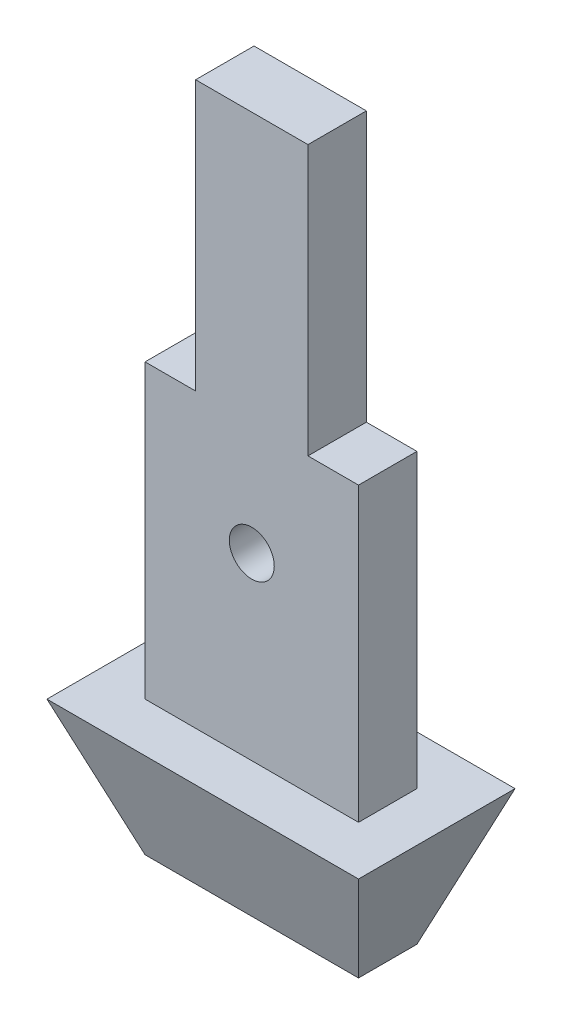
ISO-10303-21;
HEADER;
FILE_DESCRIPTION(('STEP AP214'),'2;1');
FILE_NAME('part.step','',(''),(''),'','','');
FILE_SCHEMA(('AUTOMOTIVE_DESIGN { 1 0 10303 214 1 1 1 1 }'));
ENDSEC;
DATA;
#1=APPLICATION_CONTEXT('core data for automotive mechanical design processes');
#2=APPLICATION_PROTOCOL_DEFINITION('international standard','automotive_design',2000,#1);
#3=PRODUCT_CONTEXT('',#1,'mechanical');
#4=PRODUCT('Part','Part','',(#3));
#5=PRODUCT_RELATED_PRODUCT_CATEGORY('part','',(#4));
#6=PRODUCT_DEFINITION_FORMATION('','',#4);
#7=PRODUCT_DEFINITION_CONTEXT('part definition',#1,'design');
#8=PRODUCT_DEFINITION('design','',#6,#7);
#9=PRODUCT_DEFINITION_SHAPE('','',#8);
#10=(LENGTH_UNIT() NAMED_UNIT(*) SI_UNIT(.MILLI.,.METRE.));
#11=(NAMED_UNIT(*) PLANE_ANGLE_UNIT() SI_UNIT($,.RADIAN.));
#12=(NAMED_UNIT(*) SI_UNIT($,.STERADIAN.) SOLID_ANGLE_UNIT());
#13=UNCERTAINTY_MEASURE_WITH_UNIT(LENGTH_MEASURE(1.E-05),#10,'distance_accuracy_value','');
#14=(GEOMETRIC_REPRESENTATION_CONTEXT(3) GLOBAL_UNCERTAINTY_ASSIGNED_CONTEXT((#13)) GLOBAL_UNIT_ASSIGNED_CONTEXT((#10,
#11,#12)) REPRESENTATION_CONTEXT('',''));
#15=CARTESIAN_POINT('',(0.,0.,0.));
#16=DIRECTION('',(0.,0.,1.));
#17=DIRECTION('',(1.,0.,0.));
#18=AXIS2_PLACEMENT_3D('',#15,#16,#17);
#19=CARTESIAN_POINT('',(0.,0.,2.6));
#20=DIRECTION('',(0.,0.,1.));
#21=DIRECTION('',(1.,0.,0.));
#22=AXIS2_PLACEMENT_3D('',#19,#20,#21);
#23=PLANE('',#22);
#24=CARTESIAN_POINT('',(0.,14.,2.6));
#25=DIRECTION('',(0.,0.,1.));
#26=DIRECTION('',(1.,0.,0.));
#27=AXIS2_PLACEMENT_3D('',#24,#25,#26);
#28=CIRCLE('',#27,1.);
#29=CARTESIAN_POINT('',(1.,14.,2.6));
#30=VERTEX_POINT('',#29);
#31=EDGE_CURVE('E182',#30,#30,#28,.T.);
#32=ORIENTED_EDGE('',*,*,#31,.F.);
#33=EDGE_LOOP('',(#32));
#34=FACE_BOUND('',#33,.T.);
#35=DIRECTION('',(0.,-1.,0.));
#36=VECTOR('',#35,1.);
#37=CARTESIAN_POINT('',(-4.75,19.,2.6));
#38=LINE('',#37,#36);
#39=CARTESIAN_POINT('',(-4.75,19.,2.6));
#40=VERTEX_POINT('',#39);
#41=CARTESIAN_POINT('',(-4.75,6.,2.6));
#42=VERTEX_POINT('',#41);
#43=EDGE_CURVE('E206',#40,#42,#38,.T.);
#44=ORIENTED_EDGE('',*,*,#43,.T.);
#45=DIRECTION('',(1.,0.,0.));
#46=VECTOR('',#45,1.);
#47=CARTESIAN_POINT('',(0.,6.,2.6));
#48=LINE('',#47,#46);
#49=CARTESIAN_POINT('',(4.75,6.,2.6));
#50=VERTEX_POINT('',#49);
#51=EDGE_CURVE('E219',#42,#50,#48,.T.);
#52=ORIENTED_EDGE('',*,*,#51,.T.);
#53=DIRECTION('',(0.,1.,0.));
#54=VECTOR('',#53,1.);
#55=CARTESIAN_POINT('',(4.75,19.,2.6));
#56=LINE('',#55,#54);
#57=CARTESIAN_POINT('',(4.75,19.,2.6));
#58=VERTEX_POINT('',#57);
#59=EDGE_CURVE('E200',#50,#58,#56,.T.);
#60=ORIENTED_EDGE('',*,*,#59,.T.);
#61=DIRECTION('',(-1.,0.,0.));
#62=VECTOR('',#61,1.);
#63=CARTESIAN_POINT('',(2.5,19.,2.6));
#64=LINE('',#63,#62);
#65=CARTESIAN_POINT('',(2.5,19.,2.6));
#66=VERTEX_POINT('',#65);
#67=EDGE_CURVE('E190',#58,#66,#64,.T.);
#68=ORIENTED_EDGE('',*,*,#67,.T.);
#69=DIRECTION('',(0.,1.,0.));
#70=VECTOR('',#69,1.);
#71=CARTESIAN_POINT('',(2.5,31.,2.6));
#72=LINE('',#71,#70);
#73=CARTESIAN_POINT('',(2.5,31.,2.6));
#74=VERTEX_POINT('',#73);
#75=EDGE_CURVE('E199',#66,#74,#72,.T.);
#76=ORIENTED_EDGE('',*,*,#75,.T.);
#77=DIRECTION('',(-1.,0.,0.));
#78=VECTOR('',#77,1.);
#79=CARTESIAN_POINT('',(-2.5,31.,2.6));
#80=LINE('',#79,#78);
#81=CARTESIAN_POINT('',(-2.5,31.,2.6));
#82=VERTEX_POINT('',#81);
#83=EDGE_CURVE('E173',#74,#82,#80,.T.);
#84=ORIENTED_EDGE('',*,*,#83,.T.);
#85=DIRECTION('',(0.,-1.,0.));
#86=VECTOR('',#85,1.);
#87=CARTESIAN_POINT('',(-2.5,31.,2.6));
#88=LINE('',#87,#86);
#89=CARTESIAN_POINT('',(-2.5,19.,2.6));
#90=VERTEX_POINT('',#89);
#91=EDGE_CURVE('E212',#82,#90,#88,.T.);
#92=ORIENTED_EDGE('',*,*,#91,.T.);
#93=DIRECTION('',(-1.,0.,0.));
#94=VECTOR('',#93,1.);
#95=CARTESIAN_POINT('',(-2.5,19.,2.6));
#96=LINE('',#95,#94);
#97=EDGE_CURVE('E210',#90,#40,#96,.T.);
#98=ORIENTED_EDGE('',*,*,#97,.T.);
#99=EDGE_LOOP('',(#44,#52,#60,#68,#76,#84,#92,#98));
#100=FACE_BOUND('',#99,.T.);
#101=ADVANCED_FACE('F33',(#34,#100),#23,.T.);
#102=CARTESIAN_POINT('',(0.,0.,0.));
#103=DIRECTION('',(0.,0.,1.));
#104=DIRECTION('',(1.,0.,0.));
#105=AXIS2_PLACEMENT_3D('',#102,#103,#104);
#106=PLANE('',#105);
#107=CARTESIAN_POINT('',(0.,14.,0.));
#108=DIRECTION('',(0.,0.,1.));
#109=DIRECTION('',(1.,0.,0.));
#110=AXIS2_PLACEMENT_3D('',#107,#108,#109);
#111=CIRCLE('',#110,1.);
#112=CARTESIAN_POINT('',(1.,14.,0.));
#113=VERTEX_POINT('',#112);
#114=EDGE_CURVE('E187',#113,#113,#111,.T.);
#115=ORIENTED_EDGE('',*,*,#114,.T.);
#116=EDGE_LOOP('',(#115));
#117=FACE_BOUND('',#116,.T.);
#118=DIRECTION('',(1.,0.,0.));
#119=VECTOR('',#118,1.);
#120=CARTESIAN_POINT('',(0.,6.,0.));
#121=LINE('',#120,#119);
#122=CARTESIAN_POINT('',(-4.75,6.,0.));
#123=VERTEX_POINT('',#122);
#124=CARTESIAN_POINT('',(4.75,6.,0.));
#125=VERTEX_POINT('',#124);
#126=EDGE_CURVE('E56',#123,#125,#121,.T.);
#127=ORIENTED_EDGE('',*,*,#126,.F.);
#128=DIRECTION('',(0.,-1.,0.));
#129=VECTOR('',#128,1.);
#130=CARTESIAN_POINT('',(-4.75,19.,0.));
#131=LINE('',#130,#129);
#132=CARTESIAN_POINT('',(-4.75,19.,0.));
#133=VERTEX_POINT('',#132);
#134=EDGE_CURVE('E135',#133,#123,#131,.T.);
#135=ORIENTED_EDGE('',*,*,#134,.F.);
#136=DIRECTION('',(-1.,0.,0.));
#137=VECTOR('',#136,1.);
#138=CARTESIAN_POINT('',(-2.5,19.,0.));
#139=LINE('',#138,#137);
#140=CARTESIAN_POINT('',(-2.5,19.,0.));
#141=VERTEX_POINT('',#140);
#142=EDGE_CURVE('E194',#141,#133,#139,.T.);
#143=ORIENTED_EDGE('',*,*,#142,.F.);
#144=DIRECTION('',(0.,-1.,0.));
#145=VECTOR('',#144,1.);
#146=CARTESIAN_POINT('',(-2.5,31.,0.));
#147=LINE('',#146,#145);
#148=CARTESIAN_POINT('',(-2.5,31.,0.));
#149=VERTEX_POINT('',#148);
#150=EDGE_CURVE('E184',#149,#141,#147,.T.);
#151=ORIENTED_EDGE('',*,*,#150,.F.);
#152=DIRECTION('',(-1.,0.,0.));
#153=VECTOR('',#152,1.);
#154=CARTESIAN_POINT('',(-2.5,31.,0.));
#155=LINE('',#154,#153);
#156=CARTESIAN_POINT('',(2.5,31.,0.));
#157=VERTEX_POINT('',#156);
#158=EDGE_CURVE('E172',#157,#149,#155,.T.);
#159=ORIENTED_EDGE('',*,*,#158,.F.);
#160=DIRECTION('',(0.,1.,0.));
#161=VECTOR('',#160,1.);
#162=CARTESIAN_POINT('',(2.5,31.,0.));
#163=LINE('',#162,#161);
#164=CARTESIAN_POINT('',(2.5,19.,0.));
#165=VERTEX_POINT('',#164);
#166=EDGE_CURVE('E179',#165,#157,#163,.T.);
#167=ORIENTED_EDGE('',*,*,#166,.F.);
#168=DIRECTION('',(-1.,0.,0.));
#169=VECTOR('',#168,1.);
#170=CARTESIAN_POINT('',(2.5,19.,0.));
#171=LINE('',#170,#169);
#172=CARTESIAN_POINT('',(4.75,19.,0.));
#173=VERTEX_POINT('',#172);
#174=EDGE_CURVE('E198',#173,#165,#171,.T.);
#175=ORIENTED_EDGE('',*,*,#174,.F.);
#176=DIRECTION('',(0.,1.,0.));
#177=VECTOR('',#176,1.);
#178=CARTESIAN_POINT('',(4.75,19.,0.));
#179=LINE('',#178,#177);
#180=EDGE_CURVE('E134',#125,#173,#179,.T.);
#181=ORIENTED_EDGE('',*,*,#180,.F.);
#182=EDGE_LOOP('',(#127,#135,#143,#151,#159,#167,#175,#181));
#183=FACE_BOUND('',#182,.T.);
#184=ADVANCED_FACE('F253',(#117,#183),#106,.F.);
#185=CARTESIAN_POINT('',(-4.75,19.,2.6));
#186=DIRECTION('',(1.,0.,0.));
#187=DIRECTION('',(0.,1.,0.));
#188=AXIS2_PLACEMENT_3D('',#185,#186,#187);
#189=PLANE('',#188);
#190=DIRECTION('',(0.,0.,-1.));
#191=VECTOR('',#190,1.);
#192=CARTESIAN_POINT('',(-4.75,6.,2.6));
#193=LINE('',#192,#191);
#194=EDGE_CURVE('E48',#42,#123,#193,.T.);
#195=ORIENTED_EDGE('',*,*,#194,.F.);
#196=ORIENTED_EDGE('',*,*,#43,.F.);
#197=DIRECTION('',(0.,0.,-1.));
#198=VECTOR('',#197,1.);
#199=CARTESIAN_POINT('',(-4.75,19.,2.6));
#200=LINE('',#199,#198);
#201=EDGE_CURVE('E152',#40,#133,#200,.T.);
#202=ORIENTED_EDGE('',*,*,#201,.T.);
#203=ORIENTED_EDGE('',*,*,#134,.T.);
#204=EDGE_LOOP('',(#195,#196,#202,#203));
#205=FACE_BOUND('',#204,.T.);
#206=ADVANCED_FACE('F250',(#205),#189,.F.);
#207=CARTESIAN_POINT('',(4.75,19.,2.6));
#208=DIRECTION('',(-1.,0.,0.));
#209=DIRECTION('',(0.,-1.,0.));
#210=AXIS2_PLACEMENT_3D('',#207,#208,#209);
#211=PLANE('',#210);
#212=DIRECTION('',(0.,0.,1.));
#213=VECTOR('',#212,1.);
#214=CARTESIAN_POINT('',(4.75,6.,2.6));
#215=LINE('',#214,#213);
#216=EDGE_CURVE('E11',#125,#50,#215,.T.);
#217=ORIENTED_EDGE('',*,*,#216,.F.);
#218=ORIENTED_EDGE('',*,*,#180,.T.);
#219=DIRECTION('',(0.,0.,-1.));
#220=VECTOR('',#219,1.);
#221=CARTESIAN_POINT('',(4.75,19.,2.6));
#222=LINE('',#221,#220);
#223=EDGE_CURVE('E150',#58,#173,#222,.T.);
#224=ORIENTED_EDGE('',*,*,#223,.F.);
#225=ORIENTED_EDGE('',*,*,#59,.F.);
#226=EDGE_LOOP('',(#217,#218,#224,#225));
#227=FACE_BOUND('',#226,.T.);
#228=ADVANCED_FACE('F283',(#227),#211,.F.);
#229=CARTESIAN_POINT('',(2.5,31.,2.6));
#230=DIRECTION('',(-1.,0.,0.));
#231=DIRECTION('',(0.,-1.,0.));
#232=AXIS2_PLACEMENT_3D('',#229,#230,#231);
#233=PLANE('',#232);
#234=ORIENTED_EDGE('',*,*,#166,.T.);
#235=DIRECTION('',(0.,0.,-1.));
#236=VECTOR('',#235,1.);
#237=CARTESIAN_POINT('',(2.5,31.,2.6));
#238=LINE('',#237,#236);
#239=EDGE_CURVE('E41',#74,#157,#238,.T.);
#240=ORIENTED_EDGE('',*,*,#239,.F.);
#241=ORIENTED_EDGE('',*,*,#75,.F.);
#242=DIRECTION('',(0.,0.,-1.));
#243=VECTOR('',#242,1.);
#244=CARTESIAN_POINT('',(2.5,19.,2.6));
#245=LINE('',#244,#243);
#246=EDGE_CURVE('E155',#66,#165,#245,.T.);
#247=ORIENTED_EDGE('',*,*,#246,.T.);
#248=EDGE_LOOP('',(#234,#240,#241,#247));
#249=FACE_BOUND('',#248,.T.);
#250=ADVANCED_FACE('F35',(#249),#233,.F.);
#251=CARTESIAN_POINT('',(-2.5,31.,2.6));
#252=DIRECTION('',(0.,-1.,0.));
#253=DIRECTION('',(0.,0.,-1.));
#254=AXIS2_PLACEMENT_3D('',#251,#252,#253);
#255=PLANE('',#254);
#256=ORIENTED_EDGE('',*,*,#158,.T.);
#257=DIRECTION('',(0.,0.,-1.));
#258=VECTOR('',#257,1.);
#259=CARTESIAN_POINT('',(-2.5,31.,2.6));
#260=LINE('',#259,#258);
#261=EDGE_CURVE('E164',#82,#149,#260,.T.);
#262=ORIENTED_EDGE('',*,*,#261,.F.);
#263=ORIENTED_EDGE('',*,*,#83,.F.);
#264=ORIENTED_EDGE('',*,*,#239,.T.);
#265=EDGE_LOOP('',(#256,#262,#263,#264));
#266=FACE_BOUND('',#265,.T.);
#267=ADVANCED_FACE('F170',(#266),#255,.F.);
#268=CARTESIAN_POINT('',(-2.5,31.,2.6));
#269=DIRECTION('',(1.,0.,0.));
#270=DIRECTION('',(0.,1.,0.));
#271=AXIS2_PLACEMENT_3D('',#268,#269,#270);
#272=PLANE('',#271);
#273=ORIENTED_EDGE('',*,*,#150,.T.);
#274=DIRECTION('',(0.,0.,-1.));
#275=VECTOR('',#274,1.);
#276=CARTESIAN_POINT('',(-2.5,19.,2.6));
#277=LINE('',#276,#275);
#278=EDGE_CURVE('E161',#90,#141,#277,.T.);
#279=ORIENTED_EDGE('',*,*,#278,.F.);
#280=ORIENTED_EDGE('',*,*,#91,.F.);
#281=ORIENTED_EDGE('',*,*,#261,.T.);
#282=EDGE_LOOP('',(#273,#279,#280,#281));
#283=FACE_BOUND('',#282,.T.);
#284=ADVANCED_FACE('F259',(#283),#272,.F.);
#285=CARTESIAN_POINT('',(-2.5,19.,2.6));
#286=DIRECTION('',(0.,-1.,0.));
#287=DIRECTION('',(0.,0.,-1.));
#288=AXIS2_PLACEMENT_3D('',#285,#286,#287);
#289=PLANE('',#288);
#290=ORIENTED_EDGE('',*,*,#142,.T.);
#291=ORIENTED_EDGE('',*,*,#201,.F.);
#292=ORIENTED_EDGE('',*,*,#97,.F.);
#293=ORIENTED_EDGE('',*,*,#278,.T.);
#294=EDGE_LOOP('',(#290,#291,#292,#293));
#295=FACE_BOUND('',#294,.T.);
#296=ADVANCED_FACE('F255',(#295),#289,.F.);
#297=CARTESIAN_POINT('',(2.5,19.,2.6));
#298=DIRECTION('',(0.,-1.,0.));
#299=DIRECTION('',(0.,0.,-1.));
#300=AXIS2_PLACEMENT_3D('',#297,#298,#299);
#301=PLANE('',#300);
#302=ORIENTED_EDGE('',*,*,#174,.T.);
#303=ORIENTED_EDGE('',*,*,#246,.F.);
#304=ORIENTED_EDGE('',*,*,#67,.F.);
#305=ORIENTED_EDGE('',*,*,#223,.T.);
#306=EDGE_LOOP('',(#302,#303,#304,#305));
#307=FACE_BOUND('',#306,.T.);
#308=ADVANCED_FACE('F266',(#307),#301,.F.);
#309=CARTESIAN_POINT('',(0.,14.,2.6));
#310=DIRECTION('',(0.,0.,-1.));
#311=DIRECTION('',(-1.,0.,0.));
#312=AXIS2_PLACEMENT_3D('',#309,#310,#311);
#313=CYLINDRICAL_SURFACE('',#312,1.);
#314=ORIENTED_EDGE('',*,*,#31,.T.);
#315=EDGE_LOOP('',(#314));
#316=FACE_BOUND('',#315,.T.);
#317=ORIENTED_EDGE('',*,*,#114,.F.);
#318=EDGE_LOOP('',(#317));
#319=FACE_BOUND('',#318,.T.);
#320=ADVANCED_FACE('F245',(#316,#319),#313,.F.);
#321=CARTESIAN_POINT('',(0.,6.,0.));
#322=DIRECTION('',(0.,-1.,0.));
#323=DIRECTION('',(0.,0.,-1.));
#324=AXIS2_PLACEMENT_3D('',#321,#322,#323);
#325=PLANE('',#324);
#326=DIRECTION('',(0.,0.,-1.));
#327=VECTOR('',#326,1.);
#328=CARTESIAN_POINT('',(-6.93382140559722,6.,0.));
#329=LINE('',#328,#327);
#330=CARTESIAN_POINT('',(-6.93382140559722,6.,4.78382140559722));
#331=VERTEX_POINT('',#330);
#332=CARTESIAN_POINT('',(-6.93382140559722,6.,-2.18382140559722));
#333=VERTEX_POINT('',#332);
#334=EDGE_CURVE('E225',#331,#333,#329,.T.);
#335=ORIENTED_EDGE('',*,*,#334,.F.);
#336=DIRECTION('',(-1.,0.,0.));
#337=VECTOR('',#336,1.);
#338=CARTESIAN_POINT('',(0.,6.,4.78382140559722));
#339=LINE('',#338,#337);
#340=CARTESIAN_POINT('',(6.93382140559722,6.,4.78382140559722));
#341=VERTEX_POINT('',#340);
#342=EDGE_CURVE('E227',#341,#331,#339,.T.);
#343=ORIENTED_EDGE('',*,*,#342,.F.);
#344=DIRECTION('',(0.,0.,1.));
#345=VECTOR('',#344,1.);
#346=CARTESIAN_POINT('',(6.93382140559722,6.,0.));
#347=LINE('',#346,#345);
#348=CARTESIAN_POINT('',(6.93382140559722,6.,-2.18382140559722));
#349=VERTEX_POINT('',#348);
#350=EDGE_CURVE('E224',#349,#341,#347,.T.);
#351=ORIENTED_EDGE('',*,*,#350,.F.);
#352=DIRECTION('',(1.,0.,0.));
#353=VECTOR('',#352,1.);
#354=CARTESIAN_POINT('',(0.,6.,-2.18382140559722));
#355=LINE('',#354,#353);
#356=EDGE_CURVE('E141',#333,#349,#355,.T.);
#357=ORIENTED_EDGE('',*,*,#356,.F.);
#358=EDGE_LOOP('',(#335,#343,#351,#357));
#359=FACE_BOUND('',#358,.T.);
#360=ORIENTED_EDGE('',*,*,#51,.F.);
#361=ORIENTED_EDGE('',*,*,#194,.T.);
#362=ORIENTED_EDGE('',*,*,#126,.T.);
#363=ORIENTED_EDGE('',*,*,#216,.T.);
#364=EDGE_LOOP('',(#360,#361,#362,#363));
#365=FACE_BOUND('',#364,.T.);
#366=ADVANCED_FACE('F242',(#359,#365),#325,.F.);
#367=CARTESIAN_POINT('',(-4.75,0.,2.6));
#368=DIRECTION('',(-0.939692620785908,-0.342020143325669,0.));
#369=DIRECTION('',(0.342020143325669,-0.939692620785908,0.));
#370=AXIS2_PLACEMENT_3D('',#367,#368,#369);
#371=PLANE('',#370);
#372=DIRECTION('',(0.,0.,-1.));
#373=VECTOR('',#372,1.);
#374=CARTESIAN_POINT('',(-4.75,0.,2.6));
#375=LINE('',#374,#373);
#376=CARTESIAN_POINT('',(-4.75,0.,2.6));
#377=VERTEX_POINT('',#376);
#378=CARTESIAN_POINT('',(-4.75,0.,0.));
#379=VERTEX_POINT('',#378);
#380=EDGE_CURVE('E131',#377,#379,#375,.T.);
#381=ORIENTED_EDGE('',*,*,#380,.F.);
#382=DIRECTION('',(0.323615577118185,-0.889126490715988,-0.323615577118185));
#383=VECTOR('',#382,1.);
#384=CARTESIAN_POINT('',(-3.75509310334141,-2.73348423302915,1.60509310334141));
#385=LINE('',#384,#383);
#386=EDGE_CURVE('E222',#331,#377,#385,.T.);
#387=ORIENTED_EDGE('',*,*,#386,.F.);
#388=ORIENTED_EDGE('',*,*,#334,.T.);
#389=DIRECTION('',(0.323615577118185,-0.889126490715988,0.323615577118185));
#390=VECTOR('',#389,1.);
#391=CARTESIAN_POINT('',(-4.47770969144081,-0.748111474302715,0.272290308559194));
#392=LINE('',#391,#390);
#393=EDGE_CURVE('E146',#333,#379,#392,.T.);
#394=ORIENTED_EDGE('',*,*,#393,.T.);
#395=EDGE_LOOP('',(#381,#387,#388,#394));
#396=FACE_BOUND('',#395,.T.);
#397=ADVANCED_FACE('F240',(#396),#371,.T.);
#398=CARTESIAN_POINT('',(4.75,0.,2.6));
#399=DIRECTION('',(0.,-0.342020143325669,0.939692620785908));
#400=DIRECTION('',(0.,-0.939692620785908,-0.342020143325669));
#401=AXIS2_PLACEMENT_3D('',#398,#399,#400);
#402=PLANE('',#401);
#403=DIRECTION('',(1.,0.,0.));
#404=VECTOR('',#403,1.);
#405=CARTESIAN_POINT('',(4.75,0.,2.6));
#406=LINE('',#405,#404);
#407=CARTESIAN_POINT('',(4.75,0.,2.6));
#408=VERTEX_POINT('',#407);
#409=EDGE_CURVE('E203',#377,#408,#406,.T.);
#410=ORIENTED_EDGE('',*,*,#409,.T.);
#411=DIRECTION('',(-0.323615577118185,-0.889126490715988,-0.323615577118185));
#412=VECTOR('',#411,1.);
#413=CARTESIAN_POINT('',(4.47770969144081,-0.748111474302715,2.32770969144081));
#414=LINE('',#413,#412);
#415=EDGE_CURVE('E145',#341,#408,#414,.T.);
#416=ORIENTED_EDGE('',*,*,#415,.F.);
#417=ORIENTED_EDGE('',*,*,#342,.T.);
#418=ORIENTED_EDGE('',*,*,#386,.T.);
#419=EDGE_LOOP('',(#410,#416,#417,#418));
#420=FACE_BOUND('',#419,.T.);
#421=ADVANCED_FACE('F236',(#420),#402,.T.);
#422=CARTESIAN_POINT('',(4.75,0.,0.));
#423=DIRECTION('',(0.939692620785908,-0.342020143325669,0.));
#424=DIRECTION('',(0.342020143325669,0.939692620785908,0.));
#425=AXIS2_PLACEMENT_3D('',#422,#423,#424);
#426=PLANE('',#425);
#427=DIRECTION('',(0.,0.,-1.));
#428=VECTOR('',#427,1.);
#429=CARTESIAN_POINT('',(4.75,0.,2.6));
#430=LINE('',#429,#428);
#431=CARTESIAN_POINT('',(4.75,0.,0.));
#432=VERTEX_POINT('',#431);
#433=EDGE_CURVE('E128',#408,#432,#430,.T.);
#434=ORIENTED_EDGE('',*,*,#433,.T.);
#435=DIRECTION('',(-0.323615577118185,-0.889126490715988,0.323615577118185));
#436=VECTOR('',#435,1.);
#437=CARTESIAN_POINT('',(3.75509310334141,-2.73348423302915,0.994906896658594));
#438=LINE('',#437,#436);
#439=EDGE_CURVE('E138',#349,#432,#438,.T.);
#440=ORIENTED_EDGE('',*,*,#439,.F.);
#441=ORIENTED_EDGE('',*,*,#350,.T.);
#442=ORIENTED_EDGE('',*,*,#415,.T.);
#443=EDGE_LOOP('',(#434,#440,#441,#442));
#444=FACE_BOUND('',#443,.T.);
#445=ADVANCED_FACE('F148',(#444),#426,.T.);
#446=CARTESIAN_POINT('',(-4.75,0.,0.));
#447=DIRECTION('',(0.,-0.342020143325669,-0.939692620785908));
#448=DIRECTION('',(0.,0.939692620785908,-0.342020143325669));
#449=AXIS2_PLACEMENT_3D('',#446,#447,#448);
#450=PLANE('',#449);
#451=DIRECTION('',(1.,0.,0.));
#452=VECTOR('',#451,1.);
#453=CARTESIAN_POINT('',(4.75,0.,0.));
#454=LINE('',#453,#452);
#455=EDGE_CURVE('E124',#379,#432,#454,.T.);
#456=ORIENTED_EDGE('',*,*,#455,.F.);
#457=ORIENTED_EDGE('',*,*,#393,.F.);
#458=ORIENTED_EDGE('',*,*,#356,.T.);
#459=ORIENTED_EDGE('',*,*,#439,.T.);
#460=EDGE_LOOP('',(#456,#457,#458,#459));
#461=FACE_BOUND('',#460,.T.);
#462=ADVANCED_FACE('F139',(#461),#450,.T.);
#463=CARTESIAN_POINT('',(4.75,0.,2.6));
#464=DIRECTION('',(0.,1.,0.));
#465=DIRECTION('',(0.,0.,1.));
#466=AXIS2_PLACEMENT_3D('',#463,#464,#465);
#467=PLANE('',#466);
#468=ORIENTED_EDGE('',*,*,#455,.T.);
#469=ORIENTED_EDGE('',*,*,#433,.F.);
#470=ORIENTED_EDGE('',*,*,#409,.F.);
#471=ORIENTED_EDGE('',*,*,#380,.T.);
#472=EDGE_LOOP('',(#468,#469,#470,#471));
#473=FACE_BOUND('',#472,.T.);
#474=ADVANCED_FACE('F126',(#473),#467,.F.);
#475=CLOSED_SHELL('',(#101,#184,#206,#228,#250,#267,#284,#296,#308,#320,#366,#397,#421,#445,
#462,#474));
#476=MANIFOLD_SOLID_BREP('B2',#475);
#477=ADVANCED_BREP_SHAPE_REPRESENTATION('',(#18,#476),#14);
#478=SHAPE_DEFINITION_REPRESENTATION(#9,#477);
ENDSEC;
END-ISO-10303-21;
